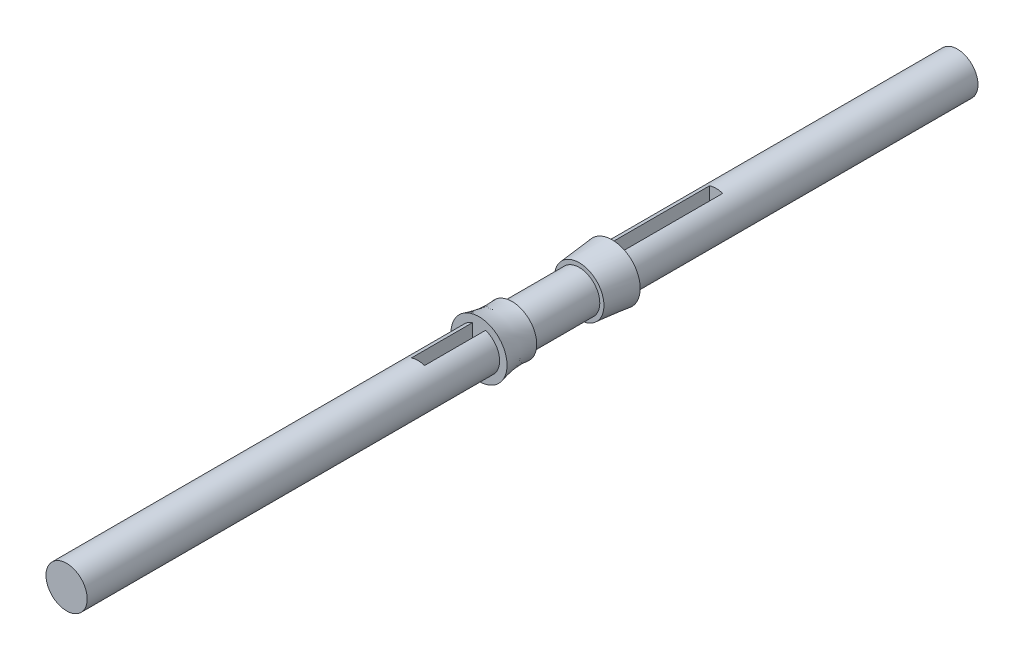
ISO-10303-21;
HEADER;
FILE_DESCRIPTION(('STEP AP214'),'2;1');
FILE_NAME('part.step','',(''),(''),'','','');
FILE_SCHEMA(('AUTOMOTIVE_DESIGN { 1 0 10303 214 1 1 1 1 }'));
ENDSEC;
DATA;
#1=APPLICATION_CONTEXT('core data for automotive mechanical design processes');
#2=APPLICATION_PROTOCOL_DEFINITION('international standard','automotive_design',2000,#1);
#3=PRODUCT_CONTEXT('',#1,'mechanical');
#4=PRODUCT('Part','Part','',(#3));
#5=PRODUCT_RELATED_PRODUCT_CATEGORY('part','',(#4));
#6=PRODUCT_DEFINITION_FORMATION('','',#4);
#7=PRODUCT_DEFINITION_CONTEXT('part definition',#1,'design');
#8=PRODUCT_DEFINITION('design','',#6,#7);
#9=PRODUCT_DEFINITION_SHAPE('','',#8);
#10=(LENGTH_UNIT() NAMED_UNIT(*) SI_UNIT(.MILLI.,.METRE.));
#11=(NAMED_UNIT(*) PLANE_ANGLE_UNIT() SI_UNIT($,.RADIAN.));
#12=(NAMED_UNIT(*) SI_UNIT($,.STERADIAN.) SOLID_ANGLE_UNIT());
#13=UNCERTAINTY_MEASURE_WITH_UNIT(LENGTH_MEASURE(1.E-05),#10,'distance_accuracy_value','');
#14=(GEOMETRIC_REPRESENTATION_CONTEXT(3) GLOBAL_UNCERTAINTY_ASSIGNED_CONTEXT((#13)) GLOBAL_UNIT_ASSIGNED_CONTEXT((#10,
#11,#12)) REPRESENTATION_CONTEXT('',''));
#15=CARTESIAN_POINT('',(0.,0.,0.));
#16=DIRECTION('',(0.,0.,1.));
#17=DIRECTION('',(1.,0.,0.));
#18=AXIS2_PLACEMENT_3D('',#15,#16,#17);
#19=CARTESIAN_POINT('',(0.,0.,500.));
#20=DIRECTION('',(0.,0.,-1.));
#21=DIRECTION('',(-1.,0.,0.));
#22=AXIS2_PLACEMENT_3D('',#19,#20,#21);
#23=CYLINDRICAL_SURFACE('',#22,12.5);
#24=CARTESIAN_POINT('',(0.,0.,540.));
#25=DIRECTION('',(0.,0.,1.));
#26=DIRECTION('',(1.,0.,0.));
#27=AXIS2_PLACEMENT_3D('',#24,#25,#26);
#28=CIRCLE('',#27,12.5);
#29=CARTESIAN_POINT('',(12.5,0.,540.));
#30=VERTEX_POINT('',#29);
#31=EDGE_CURVE('E182',#30,#30,#28,.T.);
#32=ORIENTED_EDGE('',*,*,#31,.F.);
#33=EDGE_LOOP('',(#32));
#34=FACE_BOUND('',#33,.T.);
#35=DIRECTION('',(0.,0.,-1.));
#36=VECTOR('',#35,1.);
#37=CARTESIAN_POINT('',(-4.00000000000002,11.842719282327,500.));
#38=LINE('',#37,#36);
#39=CARTESIAN_POINT('',(-4.,11.842719282327,290.));
#40=VERTEX_POINT('',#39);
#41=CARTESIAN_POINT('',(-4.,11.842719282327,327.));
#42=VERTEX_POINT('',#41);
#43=EDGE_CURVE('E12',#40,#42,#38,.F.);
#44=ORIENTED_EDGE('',*,*,#43,.F.);
#45=CARTESIAN_POINT('',(0.,0.,290.));
#46=DIRECTION('',(0.,0.,1.));
#47=DIRECTION('',(1.,0.,0.));
#48=AXIS2_PLACEMENT_3D('',#45,#46,#47);
#49=CIRCLE('',#48,12.5);
#50=CARTESIAN_POINT('',(4.,11.842719282327,290.));
#51=VERTEX_POINT('',#50);
#52=EDGE_CURVE('E140',#40,#51,#49,.T.);
#53=ORIENTED_EDGE('',*,*,#52,.T.);
#54=DIRECTION('',(0.,0.,-1.));
#55=VECTOR('',#54,1.);
#56=CARTESIAN_POINT('',(4.00000000000002,11.842719282327,500.));
#57=LINE('',#56,#55);
#58=CARTESIAN_POINT('',(4.,11.842719282327,327.));
#59=VERTEX_POINT('',#58);
#60=EDGE_CURVE('E58',#59,#51,#57,.T.);
#61=ORIENTED_EDGE('',*,*,#60,.F.);
#62=CARTESIAN_POINT('',(0.,0.,327.));
#63=DIRECTION('',(0.,0.,-1.));
#64=DIRECTION('',(-1.,0.,0.));
#65=AXIS2_PLACEMENT_3D('',#62,#63,#64);
#66=CIRCLE('',#65,12.5);
#67=EDGE_CURVE('E348',#42,#59,#66,.T.);
#68=ORIENTED_EDGE('',*,*,#67,.F.);
#69=EDGE_LOOP('',(#44,#53,#61,#68));
#70=FACE_BOUND('',#69,.T.);
#71=ADVANCED_FACE('F50',(#34,#70),#23,.T.);
#72=CARTESIAN_POINT('',(0.,0.,0.));
#73=DIRECTION('',(0.,0.,1.));
#74=DIRECTION('',(1.,0.,0.));
#75=AXIS2_PLACEMENT_3D('',#72,#73,#74);
#76=CIRCLE('',#75,12.5);
#77=CARTESIAN_POINT('',(12.5,0.,0.));
#78=VERTEX_POINT('',#77);
#79=EDGE_CURVE('E329',#78,#78,#76,.T.);
#80=ORIENTED_EDGE('',*,*,#79,.T.);
#81=EDGE_LOOP('',(#80));
#82=FACE_BOUND('',#81,.T.);
#83=DIRECTION('',(0.,0.,-1.));
#84=VECTOR('',#83,1.);
#85=CARTESIAN_POINT('',(4.00000000000004,11.842719282327,500.));
#86=LINE('',#85,#84);
#87=CARTESIAN_POINT('',(4.,11.842719282327,209.275));
#88=VERTEX_POINT('',#87);
#89=CARTESIAN_POINT('',(3.99999999999999,11.842719282327,146.275));
#90=VERTEX_POINT('',#89);
#91=EDGE_CURVE('E179',#88,#90,#86,.T.);
#92=ORIENTED_EDGE('',*,*,#91,.F.);
#93=CARTESIAN_POINT('',(0.,0.,209.275));
#94=DIRECTION('',(0.,0.,1.));
#95=DIRECTION('',(1.,0.,0.));
#96=AXIS2_PLACEMENT_3D('',#93,#94,#95);
#97=CIRCLE('',#96,12.5);
#98=CARTESIAN_POINT('',(-4.,11.842719282327,209.275));
#99=VERTEX_POINT('',#98);
#100=EDGE_CURVE('E333',#99,#88,#97,.T.);
#101=ORIENTED_EDGE('',*,*,#100,.F.);
#102=DIRECTION('',(0.,0.,-1.));
#103=VECTOR('',#102,1.);
#104=CARTESIAN_POINT('',(-4.,11.842719282327,500.));
#105=LINE('',#104,#103);
#106=CARTESIAN_POINT('',(-4.,11.842719282327,146.275));
#107=VERTEX_POINT('',#106);
#108=EDGE_CURVE('E165',#107,#99,#105,.F.);
#109=ORIENTED_EDGE('',*,*,#108,.F.);
#110=CARTESIAN_POINT('',(0.,0.,146.275));
#111=DIRECTION('',(0.,0.,1.));
#112=DIRECTION('',(1.,0.,0.));
#113=AXIS2_PLACEMENT_3D('',#110,#111,#112);
#114=CIRCLE('',#113,12.5);
#115=EDGE_CURVE('E65',#90,#107,#114,.T.);
#116=ORIENTED_EDGE('',*,*,#115,.F.);
#117=EDGE_LOOP('',(#92,#101,#109,#116));
#118=FACE_BOUND('',#117,.T.);
#119=ADVANCED_FACE('F376',(#82,#118),#23,.T.);
#120=CARTESIAN_POINT('',(0.,0.,229.275));
#121=DIRECTION('',(0.,0.,1.));
#122=DIRECTION('',(1.,0.,0.));
#123=AXIS2_PLACEMENT_3D('',#120,#121,#122);
#124=CIRCLE('',#123,12.5);
#125=CARTESIAN_POINT('',(12.5,0.,229.275));
#126=VERTEX_POINT('',#125);
#127=EDGE_CURVE('E326',#126,#126,#124,.T.);
#128=ORIENTED_EDGE('',*,*,#127,.T.);
#129=EDGE_LOOP('',(#128));
#130=FACE_BOUND('',#129,.T.);
#131=CARTESIAN_POINT('',(0.,0.,270.));
#132=DIRECTION('',(0.,0.,1.));
#133=DIRECTION('',(1.,0.,0.));
#134=AXIS2_PLACEMENT_3D('',#131,#132,#133);
#135=CIRCLE('',#134,12.5);
#136=CARTESIAN_POINT('',(12.5,0.,270.));
#137=VERTEX_POINT('',#136);
#138=EDGE_CURVE('E340',#137,#137,#135,.T.);
#139=ORIENTED_EDGE('',*,*,#138,.F.);
#140=EDGE_LOOP('',(#139));
#141=FACE_BOUND('',#140,.T.);
#142=ADVANCED_FACE('F378',(#130,#141),#23,.T.);
#143=CARTESIAN_POINT('',(0.,0.,0.));
#144=DIRECTION('',(0.,0.,1.));
#145=DIRECTION('',(1.,0.,0.));
#146=AXIS2_PLACEMENT_3D('',#143,#144,#145);
#147=PLANE('',#146);
#148=ORIENTED_EDGE('',*,*,#79,.F.);
#149=EDGE_LOOP('',(#148));
#150=FACE_BOUND('',#149,.T.);
#151=ADVANCED_FACE('F387',(#150),#147,.F.);
#152=CARTESIAN_POINT('',(0.,0.,209.275));
#153=DIRECTION('',(0.,0.,1.));
#154=DIRECTION('',(1.,0.,0.));
#155=AXIS2_PLACEMENT_3D('',#152,#153,#154);
#156=PLANE('',#155);
#157=ORIENTED_EDGE('',*,*,#100,.T.);
#158=DIRECTION('',(0.,1.,0.));
#159=VECTOR('',#158,1.);
#160=CARTESIAN_POINT('',(4.,2.5,209.275));
#161=LINE('',#160,#159);
#162=CARTESIAN_POINT('',(4.,2.5,209.275));
#163=VERTEX_POINT('',#162);
#164=EDGE_CURVE('E72',#163,#88,#161,.T.);
#165=ORIENTED_EDGE('',*,*,#164,.F.);
#166=DIRECTION('',(1.,0.,0.));
#167=VECTOR('',#166,1.);
#168=CARTESIAN_POINT('',(0.,2.5,209.275));
#169=LINE('',#168,#167);
#170=CARTESIAN_POINT('',(-4.,2.5,209.275));
#171=VERTEX_POINT('',#170);
#172=EDGE_CURVE('E158',#171,#163,#169,.T.);
#173=ORIENTED_EDGE('',*,*,#172,.F.);
#174=DIRECTION('',(0.,1.,0.));
#175=VECTOR('',#174,1.);
#176=CARTESIAN_POINT('',(-4.,2.5,209.275));
#177=LINE('',#176,#175);
#178=EDGE_CURVE('E166',#171,#99,#177,.T.);
#179=ORIENTED_EDGE('',*,*,#178,.T.);
#180=EDGE_LOOP('',(#157,#165,#173,#179));
#181=FACE_BOUND('',#180,.T.);
#182=CARTESIAN_POINT('',(0.,0.,209.275));
#183=DIRECTION('',(0.,0.,1.));
#184=DIRECTION('',(1.,0.,0.));
#185=AXIS2_PLACEMENT_3D('',#182,#183,#184);
#186=CIRCLE('',#185,17.);
#187=CARTESIAN_POINT('',(11.0811733301149,-12.8921525599083,209.275));
#188=VERTEX_POINT('',#187);
#189=EDGE_CURVE('E310',#188,#188,#186,.T.);
#190=ORIENTED_EDGE('',*,*,#189,.F.);
#191=EDGE_LOOP('',(#190));
#192=FACE_BOUND('',#191,.T.);
#193=ADVANCED_FACE('F282',(#181,#192),#156,.F.);
#194=CARTESIAN_POINT('',(0.,0.,229.275));
#195=DIRECTION('',(0.,0.,1.));
#196=DIRECTION('',(1.,0.,0.));
#197=AXIS2_PLACEMENT_3D('',#194,#195,#196);
#198=PLANE('',#197);
#199=ORIENTED_EDGE('',*,*,#127,.F.);
#200=EDGE_LOOP('',(#199));
#201=FACE_BOUND('',#200,.T.);
#202=CARTESIAN_POINT('',(0.,0.,229.275));
#203=DIRECTION('',(0.,0.,1.));
#204=DIRECTION('',(1.,0.,0.));
#205=AXIS2_PLACEMENT_3D('',#202,#203,#204);
#206=CIRCLE('',#205,15.);
#207=CARTESIAN_POINT('',(12.2123408562982,-8.70969177466051,229.275));
#208=VERTEX_POINT('',#207);
#209=EDGE_CURVE('E262',#208,#208,#206,.T.);
#210=ORIENTED_EDGE('',*,*,#209,.T.);
#211=EDGE_LOOP('',(#210));
#212=FACE_BOUND('',#211,.T.);
#213=ADVANCED_FACE('F280',(#201,#212),#198,.T.);
#214=CARTESIAN_POINT('',(12.2123408562982,-8.70969177466051,229.275));
#215=CARTESIAN_POINT('',(11.0811733301149,-12.8921525599083,209.275));
#216=CARTESIAN_POINT('',(-5.20704269302277,-33.134373487257,229.275));
#217=CARTESIAN_POINT('',(-14.7031317897016,-35.0544992201381,209.275));
#218=CARTESIAN_POINT('',(-29.6317244056192,-15.714989937936,229.275));
#219=CARTESIAN_POINT('',(-36.8654784499315,-9.27019410032161,209.275));
#220=CARTESIAN_POINT('',(-12.2123408562982,8.7096917746605,229.275));
#221=CARTESIAN_POINT('',(-11.0811733301149,12.8921525599083,209.275));
#222=CARTESIAN_POINT('',(5.20704269302277,33.134373487257,229.275));
#223=CARTESIAN_POINT('',(14.7031317897016,35.0544992201382,209.275));
#224=CARTESIAN_POINT('',(29.6317244056192,15.714989937936,229.275));
#225=CARTESIAN_POINT('',(36.8654784499315,9.27019410032161,209.275));
#226=CARTESIAN_POINT('',(12.2123408562982,-8.70969177466051,229.275));
#227=CARTESIAN_POINT('',(11.0811733301149,-12.8921525599083,209.275));
#228=(BOUNDED_SURFACE() B_SPLINE_SURFACE(3,1,((#214,#215),(#216,#217),(#218,#219),(#220,#221),
(#222,#223),(#224,#225),(#226,#227)),.UNSPECIFIED.,.T.,.F.,.F.) B_SPLINE_SURFACE_WITH_KNOTS((4,
3,4),(2,2),(0.,0.5,1.),(0.,1.),
.UNSPECIFIED.) GEOMETRIC_REPRESENTATION_ITEM() RATIONAL_B_SPLINE_SURFACE(((1.,1.),
(0.333333333333333,0.333333333333333),(0.333333333333333,0.333333333333333),(1.,1.),
(0.333333333333333,0.333333333333333),(0.333333333333333,0.333333333333333),(1.,1.))) REPRESENTATION_ITEM('') SURFACE());
#229=CARTESIAN_POINT('',(12.2123408562982,-8.70969177466051,229.275));
#230=CARTESIAN_POINT('',(12.2005578612338,-8.75325907450683,229.066666666667));
#231=CARTESIAN_POINT('',(12.1887748661694,-8.79682637435316,228.858333333333));
#232=CARTESIAN_POINT('',(12.1652088760406,-8.88396097404583,228.441666666667));
#233=CARTESIAN_POINT('',(12.1534258809762,-8.92752827389216,228.233333333333));
#234=CARTESIAN_POINT('',(12.1298598908474,-9.01466287358482,227.816666666667));
#235=CARTESIAN_POINT('',(12.118076895783,-9.05823017343115,227.608333333333));
#236=CARTESIAN_POINT('',(12.0945109056541,-9.14536477312381,227.191666666667));
#237=CARTESIAN_POINT('',(12.0827279105897,-9.18893207297015,226.983333333333));
#238=CARTESIAN_POINT('',(12.0591619204609,-9.27606667266281,226.566666666667));
#239=CARTESIAN_POINT('',(12.0473789253965,-9.31963397250914,226.358333333333));
#240=CARTESIAN_POINT('',(12.0238129352677,-9.4067685722018,225.941666666667));
#241=CARTESIAN_POINT('',(12.0120299402033,-9.45033587204813,225.733333333333));
#242=CARTESIAN_POINT('',(11.9884639500745,-9.53747047174079,225.316666666667));
#243=CARTESIAN_POINT('',(11.97668095501,-9.58103777158713,225.108333333333));
#244=CARTESIAN_POINT('',(11.9531149648812,-9.66817237127979,224.691666666667));
#245=CARTESIAN_POINT('',(11.9413319698168,-9.71173967112611,224.483333333333));
#246=CARTESIAN_POINT('',(11.917765979688,-9.79887427081878,224.066666666667));
#247=CARTESIAN_POINT('',(11.9059829846236,-9.84244157066511,223.858333333333));
#248=CARTESIAN_POINT('',(11.8824169944948,-9.92957617035777,223.441666666667));
#249=CARTESIAN_POINT('',(11.8706339994304,-9.97314347020411,223.233333333333));
#250=CARTESIAN_POINT('',(11.8470680093015,-10.0602780698968,222.816666666667));
#251=CARTESIAN_POINT('',(11.8352850142371,-10.1038453697431,222.608333333333));
#252=CARTESIAN_POINT('',(11.8117190241083,-10.1909799694358,222.191666666667));
#253=CARTESIAN_POINT('',(11.7999360290439,-10.2345472692821,221.983333333333));
#254=CARTESIAN_POINT('',(11.7763700389151,-10.3216818689748,221.566666666667));
#255=CARTESIAN_POINT('',(11.7645870438507,-10.3652491688211,221.358333333333));
#256=CARTESIAN_POINT('',(11.7410210537219,-10.4523837685137,220.941666666667));
#257=CARTESIAN_POINT('',(11.7292380586575,-10.4959510683601,220.733333333333));
#258=CARTESIAN_POINT('',(11.7056720685286,-10.5830856680527,220.316666666667));
#259=CARTESIAN_POINT('',(11.6938890734642,-10.6266529678991,220.108333333333));
#260=CARTESIAN_POINT('',(11.6703230833354,-10.7137875675917,219.691666666667));
#261=CARTESIAN_POINT('',(11.658540088271,-10.7573548674381,219.483333333333));
#262=CARTESIAN_POINT('',(11.6349740981422,-10.8444894671307,219.066666666667));
#263=CARTESIAN_POINT('',(11.6231911030778,-10.888056766977,218.858333333333));
#264=CARTESIAN_POINT('',(11.5996251129489,-10.9751913666697,218.441666666667));
#265=CARTESIAN_POINT('',(11.5878421178845,-11.018758666516,218.233333333333));
#266=CARTESIAN_POINT('',(11.5642761277557,-11.1058932662087,217.816666666667));
#267=CARTESIAN_POINT('',(11.5524931326913,-11.149460566055,217.608333333333));
#268=CARTESIAN_POINT('',(11.5289271425625,-11.2365951657477,217.191666666667));
#269=CARTESIAN_POINT('',(11.5171441474981,-11.280162465594,216.983333333333));
#270=CARTESIAN_POINT('',(11.4935781573693,-11.3672970652867,216.566666666667));
#271=CARTESIAN_POINT('',(11.4817951623049,-11.410864365133,216.358333333333));
#272=CARTESIAN_POINT('',(11.458229172176,-11.4979989648257,215.941666666667));
#273=CARTESIAN_POINT('',(11.4464461771116,-11.541566264672,215.733333333333));
#274=CARTESIAN_POINT('',(11.4228801869828,-11.6287008643647,215.316666666667));
#275=CARTESIAN_POINT('',(11.4110971919184,-11.672268164211,215.108333333333));
#276=CARTESIAN_POINT('',(11.3875312017896,-11.7594027639037,214.691666666667));
#277=CARTESIAN_POINT('',(11.3757482067252,-11.80297006375,214.483333333333));
#278=CARTESIAN_POINT('',(11.3521822165964,-11.8901046634427,214.066666666667));
#279=CARTESIAN_POINT('',(11.3403992215319,-11.933671963289,213.858333333333));
#280=CARTESIAN_POINT('',(11.3168332314031,-12.0208065629817,213.441666666667));
#281=CARTESIAN_POINT('',(11.3050502363387,-12.064373862828,213.233333333333));
#282=CARTESIAN_POINT('',(11.2814842462099,-12.1515084625206,212.816666666667));
#283=CARTESIAN_POINT('',(11.2697012511455,-12.195075762367,212.608333333333));
#284=CARTESIAN_POINT('',(11.2461352610167,-12.2822103620596,212.191666666667));
#285=CARTESIAN_POINT('',(11.2343522659523,-12.325777661906,211.983333333333));
#286=CARTESIAN_POINT('',(11.2107862758234,-12.4129122615986,211.566666666667));
#287=CARTESIAN_POINT('',(11.199003280759,-12.456479561445,211.358333333333));
#288=CARTESIAN_POINT('',(11.1754372906302,-12.5436141611376,210.941666666667));
#289=CARTESIAN_POINT('',(11.1636542955658,-12.587181460984,210.733333333333));
#290=CARTESIAN_POINT('',(11.140088305437,-12.6743160606766,210.316666666667));
#291=CARTESIAN_POINT('',(11.1283053103726,-12.7178833605229,210.108333333333));
#292=CARTESIAN_POINT('',(11.1047393202438,-12.8050179602156,209.691666666667));
#293=CARTESIAN_POINT('',(11.0929563251793,-12.8485852600619,209.483333333333));
#294=CARTESIAN_POINT('',(11.0811733301149,-12.8921525599083,209.275));
#295=B_SPLINE_CURVE_WITH_KNOTS('',3,(#229,#230,#231,#232,#233,#234,#235,#236,#237,#238,#239,
#240,#241,#242,#243,#244,#245,#246,#247,#248,#249,#250,#251,#252,#253,#254,#255,#256,#257,#258,
#259,#260,#261,#262,#263,#264,#265,#266,#267,#268,#269,#270,#271,#272,#273,#274,#275,#276,#277,
#278,#279,#280,#281,#282,#283,#284,#285,#286,#287,#288,#289,#290,#291,#292,#293,#294),
.UNSPECIFIED.,.F.,.F.,(4,2,2,2,2,2,2,2,2,2,2,2,2,2,2,2,2,2,2,2,2,2,2,2,2,2,2,2,2,2,2,2,4),(0.,
0.639497879040509,1.27899575808099,1.9184936371215,2.55799151616196,3.19748939520247,
3.83698727424298,4.47648515328346,5.11598303232397,5.75548091136445,6.39497879040493,
7.03447666944547,7.67397454848595,8.31347242752643,8.95297030656694,9.59246818560743,
10.2319660646479,10.8714639436884,11.5109618227289,12.1504597017694,12.7899575808099,
13.4294554598504,14.0689533388909,14.7084512179314,15.3479490969719,15.9874469760124,
16.6269448550529,17.2664427340934,17.9059406131339,18.5454384921743,19.1849363712149,
19.8244342502553,20.4639321292958),.UNSPECIFIED.);
#296=EDGE_CURVE('BSEAM269',#208,#188,#295,.T.);
#297=ORIENTED_EDGE('',*,*,#209,.F.);
#298=ORIENTED_EDGE('',*,*,#189,.T.);
#299=ORIENTED_EDGE('',*,*,#296,.T.);
#300=ORIENTED_EDGE('',*,*,#296,.F.);
#301=EDGE_LOOP('',(#297,#299,#298,#300));
#302=FACE_BOUND('',#301,.T.);
#303=ADVANCED_FACE('F269',(#302),#228,.T.);
#304=CARTESIAN_POINT('',(0.,0.,270.));
#305=DIRECTION('',(0.,0.,1.));
#306=DIRECTION('',(1.,0.,0.));
#307=AXIS2_PLACEMENT_3D('',#304,#305,#306);
#308=PLANE('',#307);
#309=ORIENTED_EDGE('',*,*,#138,.T.);
#310=EDGE_LOOP('',(#309));
#311=FACE_BOUND('',#310,.T.);
#312=CARTESIAN_POINT('',(0.,0.,270.));
#313=DIRECTION('',(0.,0.,1.));
#314=DIRECTION('',(1.,0.,0.));
#315=AXIS2_PLACEMENT_3D('',#312,#313,#314);
#316=CIRCLE('',#315,15.);
#317=CARTESIAN_POINT('',(-12.1352549156242,8.8167787843871,270.));
#318=VERTEX_POINT('',#317);
#319=EDGE_CURVE('E240',#318,#318,#316,.T.);
#320=ORIENTED_EDGE('',*,*,#319,.F.);
#321=EDGE_LOOP('',(#320));
#322=FACE_BOUND('',#321,.T.);
#323=ADVANCED_FACE('F212',(#311,#322),#308,.F.);
#324=CARTESIAN_POINT('',(0.,0.,290.));
#325=DIRECTION('',(0.,0.,1.));
#326=DIRECTION('',(1.,0.,0.));
#327=AXIS2_PLACEMENT_3D('',#324,#325,#326);
#328=PLANE('',#327);
#329=DIRECTION('',(0.,1.,0.));
#330=VECTOR('',#329,1.);
#331=CARTESIAN_POINT('',(4.,2.5,290.));
#332=LINE('',#331,#330);
#333=CARTESIAN_POINT('',(4.,2.5,290.));
#334=VERTEX_POINT('',#333);
#335=EDGE_CURVE('E143',#334,#51,#332,.T.);
#336=ORIENTED_EDGE('',*,*,#335,.T.);
#337=ORIENTED_EDGE('',*,*,#52,.F.);
#338=DIRECTION('',(0.,1.,0.));
#339=VECTOR('',#338,1.);
#340=CARTESIAN_POINT('',(-4.,2.5,290.));
#341=LINE('',#340,#339);
#342=CARTESIAN_POINT('',(-4.,2.5,290.));
#343=VERTEX_POINT('',#342);
#344=EDGE_CURVE('E130',#343,#40,#341,.T.);
#345=ORIENTED_EDGE('',*,*,#344,.F.);
#346=DIRECTION('',(1.,0.,0.));
#347=VECTOR('',#346,1.);
#348=CARTESIAN_POINT('',(-4.,2.5,290.));
#349=LINE('',#348,#347);
#350=EDGE_CURVE('E115',#343,#334,#349,.T.);
#351=ORIENTED_EDGE('',*,*,#350,.T.);
#352=EDGE_LOOP('',(#336,#337,#345,#351));
#353=FACE_BOUND('',#352,.T.);
#354=CARTESIAN_POINT('',(0.,0.,290.));
#355=DIRECTION('',(0.,0.,1.));
#356=DIRECTION('',(1.,0.,0.));
#357=AXIS2_PLACEMENT_3D('',#354,#355,#356);
#358=CIRCLE('',#357,17.);
#359=CARTESIAN_POINT('',(-16.9204791103401,-1.64237227099794,290.));
#360=VERTEX_POINT('',#359);
#361=EDGE_CURVE('E186',#360,#360,#358,.T.);
#362=ORIENTED_EDGE('',*,*,#361,.T.);
#363=EDGE_LOOP('',(#362));
#364=FACE_BOUND('',#363,.T.);
#365=ADVANCED_FACE('F137',(#353,#364),#328,.T.);
#366=CARTESIAN_POINT('',(-16.9204791103401,-1.64237227099794,290.));
#367=CARTESIAN_POINT('',(-12.1352549156242,8.8167787843871,270.));
#368=CARTESIAN_POINT('',(-20.205223652336,32.1985859496823,290.));
#369=CARTESIAN_POINT('',(5.49830265314998,33.0872886156355,270.));
#370=CARTESIAN_POINT('',(13.6357345683443,35.4833304916782,290.));
#371=CARTESIAN_POINT('',(29.7688124843984,15.4537310468613,270.));
#372=CARTESIAN_POINT('',(16.9204791103401,1.64237227099794,290.));
#373=CARTESIAN_POINT('',(12.1352549156242,-8.8167787843871,270.));
#374=CARTESIAN_POINT('',(20.205223652336,-32.1985859496824,290.));
#375=CARTESIAN_POINT('',(-5.49830265314999,-33.0872886156355,270.));
#376=CARTESIAN_POINT('',(-13.6357345683443,-35.4833304916782,290.));
#377=CARTESIAN_POINT('',(-29.7688124843984,-15.4537310468613,270.));
#378=CARTESIAN_POINT('',(-16.9204791103401,-1.64237227099794,290.));
#379=CARTESIAN_POINT('',(-12.1352549156242,8.8167787843871,270.));
#380=(BOUNDED_SURFACE() B_SPLINE_SURFACE(3,1,((#366,#367),(#368,#369),(#370,#371),(#372,#373),
(#374,#375),(#376,#377),(#378,#379)),.UNSPECIFIED.,.T.,.F.,.F.) B_SPLINE_SURFACE_WITH_KNOTS((4,
3,4),(2,2),(0.,0.5,1.),(0.,1.),
.UNSPECIFIED.) GEOMETRIC_REPRESENTATION_ITEM() RATIONAL_B_SPLINE_SURFACE(((1.,1.),
(0.333333333333333,0.333333333333333),(0.333333333333333,0.333333333333333),(1.,1.),
(0.333333333333333,0.333333333333333),(0.333333333333333,0.333333333333333),(1.,1.))) REPRESENTATION_ITEM('') SURFACE());
#381=CARTESIAN_POINT('',(-16.9204791103401,-1.64237227099794,290.));
#382=CARTESIAN_POINT('',(-16.8706330249785,-1.53342278083766,289.791666666667));
#383=CARTESIAN_POINT('',(-16.8207869396169,-1.42447329067741,289.583333333333));
#384=CARTESIAN_POINT('',(-16.7210947688936,-1.2065743103569,289.166666666667));
#385=CARTESIAN_POINT('',(-16.671248683532,-1.09762482019664,288.958333333333));
#386=CARTESIAN_POINT('',(-16.5715565128088,-0.879725839876116,288.541666666667));
#387=CARTESIAN_POINT('',(-16.5217104274471,-0.770776349715844,288.333333333333));
#388=CARTESIAN_POINT('',(-16.4220182567239,-0.552877369395321,287.916666666667));
#389=CARTESIAN_POINT('',(-16.3721721713623,-0.443927879235069,287.708333333333));
#390=CARTESIAN_POINT('',(-16.272480000639,-0.226028898914553,287.291666666667));
#391=CARTESIAN_POINT('',(-16.2226339152774,-0.117079408754289,287.083333333333));
#392=CARTESIAN_POINT('',(-16.1229417445542,0.100819571566239,286.666666666667));
#393=CARTESIAN_POINT('',(-16.0730956591925,0.209769061726501,286.458333333333));
#394=CARTESIAN_POINT('',(-15.9734034884693,0.42766804204702,286.041666666667));
#395=CARTESIAN_POINT('',(-15.9235574031077,0.536617532207276,285.833333333333));
#396=CARTESIAN_POINT('',(-15.8238652323844,0.754516512527796,285.416666666667));
#397=CARTESIAN_POINT('',(-15.7740191470228,0.86346600268806,285.208333333333));
#398=CARTESIAN_POINT('',(-15.6743269762995,1.08136498300858,284.791666666667));
#399=CARTESIAN_POINT('',(-15.6244808909379,1.19031447316884,284.583333333333));
#400=CARTESIAN_POINT('',(-15.5247887202147,1.40821345348936,284.166666666667));
#401=CARTESIAN_POINT('',(-15.474942634853,1.51716294364962,283.958333333333));
#402=CARTESIAN_POINT('',(-15.3752504641298,1.73506192397015,283.541666666667));
#403=CARTESIAN_POINT('',(-15.3254043787682,1.84401141413041,283.333333333333));
#404=CARTESIAN_POINT('',(-15.2257122080449,2.06191039445093,282.916666666667));
#405=CARTESIAN_POINT('',(-15.1758661226833,2.17085988461119,282.708333333333));
#406=CARTESIAN_POINT('',(-15.07617395196,2.38875886493171,282.291666666667));
#407=CARTESIAN_POINT('',(-15.0263278665984,2.49770835509197,282.083333333333));
#408=CARTESIAN_POINT('',(-14.9266356958752,2.7156073354125,281.666666666667));
#409=CARTESIAN_POINT('',(-14.8767896105135,2.82455682557276,281.458333333333));
#410=CARTESIAN_POINT('',(-14.7770974397903,3.04245580589328,281.041666666667));
#411=CARTESIAN_POINT('',(-14.7272513544287,3.15140529605354,280.833333333333));
#412=CARTESIAN_POINT('',(-14.6275591837054,3.36930427637406,280.416666666667));
#413=CARTESIAN_POINT('',(-14.5777130983438,3.47825376653432,280.208333333333));
#414=CARTESIAN_POINT('',(-14.4780209276206,3.69615274685484,279.791666666667));
#415=CARTESIAN_POINT('',(-14.4281748422589,3.8051022370151,279.583333333333));
#416=CARTESIAN_POINT('',(-14.3284826715357,4.02300121733562,279.166666666667));
#417=CARTESIAN_POINT('',(-14.2786365861741,4.13195070749588,278.958333333333));
#418=CARTESIAN_POINT('',(-14.1789444154508,4.34984968781641,278.541666666667));
#419=CARTESIAN_POINT('',(-14.1290983300892,4.45879917797667,278.333333333333));
#420=CARTESIAN_POINT('',(-14.0294061593659,4.67669815829719,277.916666666667));
#421=CARTESIAN_POINT('',(-13.9795600740043,4.78564764845745,277.708333333333));
#422=CARTESIAN_POINT('',(-13.8798679032811,5.00354662877797,277.291666666667));
#423=CARTESIAN_POINT('',(-13.8300218179194,5.11249611893823,277.083333333333));
#424=CARTESIAN_POINT('',(-13.7303296471962,5.33039509925875,276.666666666667));
#425=CARTESIAN_POINT('',(-13.6804835618346,5.43934458941901,276.458333333333));
#426=CARTESIAN_POINT('',(-13.5807913911113,5.65724356973953,276.041666666667));
#427=CARTESIAN_POINT('',(-13.5309453057497,5.76619305989979,275.833333333333));
#428=CARTESIAN_POINT('',(-13.4312531350264,5.98409204022032,275.416666666667));
#429=CARTESIAN_POINT('',(-13.3814070496648,6.09304153038058,275.208333333333));
#430=CARTESIAN_POINT('',(-13.2817148789416,6.3109405107011,274.791666666667));
#431=CARTESIAN_POINT('',(-13.2318687935799,6.41989000086136,274.583333333333));
#432=CARTESIAN_POINT('',(-13.1321766228567,6.63778898118188,274.166666666667));
#433=CARTESIAN_POINT('',(-13.0823305374951,6.74673847134214,273.958333333333));
#434=CARTESIAN_POINT('',(-12.9826383667718,6.96463745166267,273.541666666667));
#435=CARTESIAN_POINT('',(-12.9327922814102,7.07358694182292,273.333333333333));
#436=CARTESIAN_POINT('',(-12.833100110687,7.29148592214345,272.916666666667));
#437=CARTESIAN_POINT('',(-12.7832540253253,7.40043541230371,272.708333333333));
#438=CARTESIAN_POINT('',(-12.6835618546021,7.61833439262423,272.291666666667));
#439=CARTESIAN_POINT('',(-12.6337157692405,7.72728388278448,272.083333333333));
#440=CARTESIAN_POINT('',(-12.5340235985172,7.945182863105,271.666666666667));
#441=CARTESIAN_POINT('',(-12.4841775131556,8.05413235326528,271.458333333333));
#442=CARTESIAN_POINT('',(-12.3844853424323,8.2720313335858,271.041666666667));
#443=CARTESIAN_POINT('',(-12.3346392570707,8.38098082374606,270.833333333333));
#444=CARTESIAN_POINT('',(-12.2349470863475,8.59887980406657,270.416666666667));
#445=CARTESIAN_POINT('',(-12.1851010009858,8.70782929422682,270.208333333333));
#446=CARTESIAN_POINT('',(-12.1352549156242,8.8167787843871,270.));
#447=B_SPLINE_CURVE_WITH_KNOTS('',3,(#381,#382,#383,#384,#385,#386,#387,#388,#389,#390,#391,
#392,#393,#394,#395,#396,#397,#398,#399,#400,#401,#402,#403,#404,#405,#406,#407,#408,#409,#410,
#411,#412,#413,#414,#415,#416,#417,#418,#419,#420,#421,#422,#423,#424,#425,#426,#427,#428,#429,
#430,#431,#432,#433,#434,#435,#436,#437,#438,#439,#440,#441,#442,#443,#444,#445,#446),
.UNSPECIFIED.,.F.,.F.,(4,2,2,2,2,2,2,2,2,2,2,2,2,2,2,2,2,2,2,2,2,2,2,2,2,2,2,2,2,2,2,2,4),(0.,
0.720983087657759,1.44196617531556,2.16294926297328,2.88393235063108,3.60491543828884,
4.3258985259466,5.04688161360441,5.76786470126217,6.48884778891992,7.20983087657768,
7.93081396423544,8.65179705189325,9.37278013955101,10.0937632272088,10.8147463148665,
11.5357294025243,12.2567124901821,12.9776955778398,13.6986786654976,14.4196617531554,
15.1406448408132,15.8616279284709,16.5826110161287,17.3035941037864,18.0245771914442,
18.745560279102,19.4665433667598,20.1875264544175,20.9085095420753,21.629492629733,
22.3504757173908,23.0714588050486),.UNSPECIFIED.);
#448=EDGE_CURVE('BSEAM197',#360,#318,#447,.T.);
#449=ORIENTED_EDGE('',*,*,#361,.F.);
#450=ORIENTED_EDGE('',*,*,#319,.T.);
#451=ORIENTED_EDGE('',*,*,#448,.T.);
#452=ORIENTED_EDGE('',*,*,#448,.F.);
#453=EDGE_LOOP('',(#449,#451,#450,#452));
#454=FACE_BOUND('',#453,.T.);
#455=ADVANCED_FACE('F197',(#454),#380,.T.);
#456=CARTESIAN_POINT('',(0.,0.,540.));
#457=DIRECTION('',(0.,0.,1.));
#458=DIRECTION('',(1.,0.,0.));
#459=AXIS2_PLACEMENT_3D('',#456,#457,#458);
#460=PLANE('',#459);
#461=ORIENTED_EDGE('',*,*,#31,.T.);
#462=EDGE_LOOP('',(#461));
#463=FACE_BOUND('',#462,.T.);
#464=ADVANCED_FACE('F209',(#463),#460,.T.);
#465=CARTESIAN_POINT('',(0.,2.5,146.275));
#466=DIRECTION('',(0.,0.,1.));
#467=DIRECTION('',(1.,0.,0.));
#468=AXIS2_PLACEMENT_3D('',#465,#466,#467);
#469=PLANE('',#468);
#470=DIRECTION('',(0.,1.,0.));
#471=VECTOR('',#470,1.);
#472=CARTESIAN_POINT('',(3.99999999999999,2.5,146.275));
#473=LINE('',#472,#471);
#474=CARTESIAN_POINT('',(3.99999999999999,2.5,146.275));
#475=VERTEX_POINT('',#474);
#476=EDGE_CURVE('E162',#475,#90,#473,.T.);
#477=ORIENTED_EDGE('',*,*,#476,.T.);
#478=ORIENTED_EDGE('',*,*,#115,.T.);
#479=DIRECTION('',(0.,1.,0.));
#480=VECTOR('',#479,1.);
#481=CARTESIAN_POINT('',(-4.,2.5,146.275));
#482=LINE('',#481,#480);
#483=CARTESIAN_POINT('',(-4.,2.5,146.275));
#484=VERTEX_POINT('',#483);
#485=EDGE_CURVE('E170',#484,#107,#482,.T.);
#486=ORIENTED_EDGE('',*,*,#485,.F.);
#487=DIRECTION('',(1.,0.,0.));
#488=VECTOR('',#487,1.);
#489=CARTESIAN_POINT('',(0.,2.5,146.275));
#490=LINE('',#489,#488);
#491=EDGE_CURVE('E147',#484,#475,#490,.T.);
#492=ORIENTED_EDGE('',*,*,#491,.T.);
#493=EDGE_LOOP('',(#477,#478,#486,#492));
#494=FACE_BOUND('',#493,.T.);
#495=ADVANCED_FACE('F457',(#494),#469,.T.);
#496=CARTESIAN_POINT('',(3.99999999999997,2.5,0.));
#497=DIRECTION('',(-1.,0.,0.));
#498=DIRECTION('',(0.,0.,1.));
#499=AXIS2_PLACEMENT_3D('',#496,#497,#498);
#500=PLANE('',#499);
#501=ORIENTED_EDGE('',*,*,#91,.T.);
#502=ORIENTED_EDGE('',*,*,#476,.F.);
#503=DIRECTION('',(0.,0.,1.));
#504=VECTOR('',#503,1.);
#505=CARTESIAN_POINT('',(3.99999999999997,2.5,0.));
#506=LINE('',#505,#504);
#507=EDGE_CURVE('E142',#475,#163,#506,.T.);
#508=ORIENTED_EDGE('',*,*,#507,.T.);
#509=ORIENTED_EDGE('',*,*,#164,.T.);
#510=EDGE_LOOP('',(#501,#502,#508,#509));
#511=FACE_BOUND('',#510,.T.);
#512=ADVANCED_FACE('F448',(#511),#500,.T.);
#513=CARTESIAN_POINT('',(-4.,2.5,0.));
#514=DIRECTION('',(1.,0.,0.));
#515=DIRECTION('',(0.,0.,-1.));
#516=AXIS2_PLACEMENT_3D('',#513,#514,#515);
#517=PLANE('',#516);
#518=ORIENTED_EDGE('',*,*,#108,.T.);
#519=ORIENTED_EDGE('',*,*,#178,.F.);
#520=DIRECTION('',(0.,0.,-1.));
#521=VECTOR('',#520,1.);
#522=CARTESIAN_POINT('',(-4.,2.5,0.));
#523=LINE('',#522,#521);
#524=EDGE_CURVE('E155',#171,#484,#523,.T.);
#525=ORIENTED_EDGE('',*,*,#524,.T.);
#526=ORIENTED_EDGE('',*,*,#485,.T.);
#527=EDGE_LOOP('',(#518,#519,#525,#526));
#528=FACE_BOUND('',#527,.T.);
#529=ADVANCED_FACE('F439',(#528),#517,.T.);
#530=CARTESIAN_POINT('',(0.,2.5,0.));
#531=DIRECTION('',(0.,1.,0.));
#532=DIRECTION('',(0.,0.,1.));
#533=AXIS2_PLACEMENT_3D('',#530,#531,#532);
#534=PLANE('',#533);
#535=ORIENTED_EDGE('',*,*,#507,.F.);
#536=ORIENTED_EDGE('',*,*,#491,.F.);
#537=ORIENTED_EDGE('',*,*,#524,.F.);
#538=ORIENTED_EDGE('',*,*,#172,.T.);
#539=EDGE_LOOP('',(#535,#536,#537,#538));
#540=FACE_BOUND('',#539,.T.);
#541=ADVANCED_FACE('F408',(#540),#534,.T.);
#542=CARTESIAN_POINT('',(-4.,2.5,327.));
#543=DIRECTION('',(1.,0.,0.));
#544=DIRECTION('',(0.,0.,-1.));
#545=AXIS2_PLACEMENT_3D('',#542,#543,#544);
#546=PLANE('',#545);
#547=ORIENTED_EDGE('',*,*,#43,.T.);
#548=DIRECTION('',(0.,1.,0.));
#549=VECTOR('',#548,1.);
#550=CARTESIAN_POINT('',(-4.,2.5,327.));
#551=LINE('',#550,#549);
#552=CARTESIAN_POINT('',(-4.,2.5,327.));
#553=VERTEX_POINT('',#552);
#554=EDGE_CURVE('E133',#553,#42,#551,.T.);
#555=ORIENTED_EDGE('',*,*,#554,.F.);
#556=DIRECTION('',(0.,0.,-1.));
#557=VECTOR('',#556,1.);
#558=CARTESIAN_POINT('',(-4.,2.5,327.));
#559=LINE('',#558,#557);
#560=EDGE_CURVE('E119',#553,#343,#559,.T.);
#561=ORIENTED_EDGE('',*,*,#560,.T.);
#562=ORIENTED_EDGE('',*,*,#344,.T.);
#563=EDGE_LOOP('',(#547,#555,#561,#562));
#564=FACE_BOUND('',#563,.T.);
#565=ADVANCED_FACE('F129',(#564),#546,.T.);
#566=CARTESIAN_POINT('',(4.,2.5,290.));
#567=DIRECTION('',(-1.,0.,0.));
#568=DIRECTION('',(0.,0.,1.));
#569=AXIS2_PLACEMENT_3D('',#566,#567,#568);
#570=PLANE('',#569);
#571=ORIENTED_EDGE('',*,*,#60,.T.);
#572=ORIENTED_EDGE('',*,*,#335,.F.);
#573=DIRECTION('',(0.,0.,1.));
#574=VECTOR('',#573,1.);
#575=CARTESIAN_POINT('',(4.,2.5,290.));
#576=LINE('',#575,#574);
#577=CARTESIAN_POINT('',(4.,2.5,327.));
#578=VERTEX_POINT('',#577);
#579=EDGE_CURVE('E120',#334,#578,#576,.T.);
#580=ORIENTED_EDGE('',*,*,#579,.T.);
#581=DIRECTION('',(0.,1.,0.));
#582=VECTOR('',#581,1.);
#583=CARTESIAN_POINT('',(4.,2.5,327.));
#584=LINE('',#583,#582);
#585=EDGE_CURVE('E149',#578,#59,#584,.T.);
#586=ORIENTED_EDGE('',*,*,#585,.T.);
#587=EDGE_LOOP('',(#571,#572,#580,#586));
#588=FACE_BOUND('',#587,.T.);
#589=ADVANCED_FACE('F354',(#588),#570,.T.);
#590=CARTESIAN_POINT('',(4.,2.5,327.));
#591=DIRECTION('',(0.,0.,-1.));
#592=DIRECTION('',(-1.,0.,0.));
#593=AXIS2_PLACEMENT_3D('',#590,#591,#592);
#594=PLANE('',#593);
#595=ORIENTED_EDGE('',*,*,#554,.T.);
#596=ORIENTED_EDGE('',*,*,#67,.T.);
#597=ORIENTED_EDGE('',*,*,#585,.F.);
#598=DIRECTION('',(-1.,0.,0.));
#599=VECTOR('',#598,1.);
#600=CARTESIAN_POINT('',(4.,2.5,327.));
#601=LINE('',#600,#599);
#602=EDGE_CURVE('E359',#578,#553,#601,.T.);
#603=ORIENTED_EDGE('',*,*,#602,.T.);
#604=EDGE_LOOP('',(#595,#596,#597,#603));
#605=FACE_BOUND('',#604,.T.);
#606=ADVANCED_FACE('F358',(#605),#594,.T.);
#607=CARTESIAN_POINT('',(0.,2.5,0.));
#608=DIRECTION('',(0.,-1.,0.));
#609=DIRECTION('',(0.,0.,-1.));
#610=AXIS2_PLACEMENT_3D('',#607,#608,#609);
#611=PLANE('',#610);
#612=ORIENTED_EDGE('',*,*,#560,.F.);
#613=ORIENTED_EDGE('',*,*,#602,.F.);
#614=ORIENTED_EDGE('',*,*,#579,.F.);
#615=ORIENTED_EDGE('',*,*,#350,.F.);
#616=EDGE_LOOP('',(#612,#613,#614,#615));
#617=FACE_BOUND('',#616,.T.);
#618=ADVANCED_FACE('F117',(#617),#611,.F.);
#619=CLOSED_SHELL('',(#71,#119,#142,#151,#193,#213,#303,#323,#365,#455,#464,#495,#512,#529,#541,
#565,#589,#606,#618));
#620=MANIFOLD_SOLID_BREP('B2',#619);
#621=ADVANCED_BREP_SHAPE_REPRESENTATION('',(#18,#620),#14);
#622=SHAPE_DEFINITION_REPRESENTATION(#9,#621);
ENDSEC;
END-ISO-10303-21;
